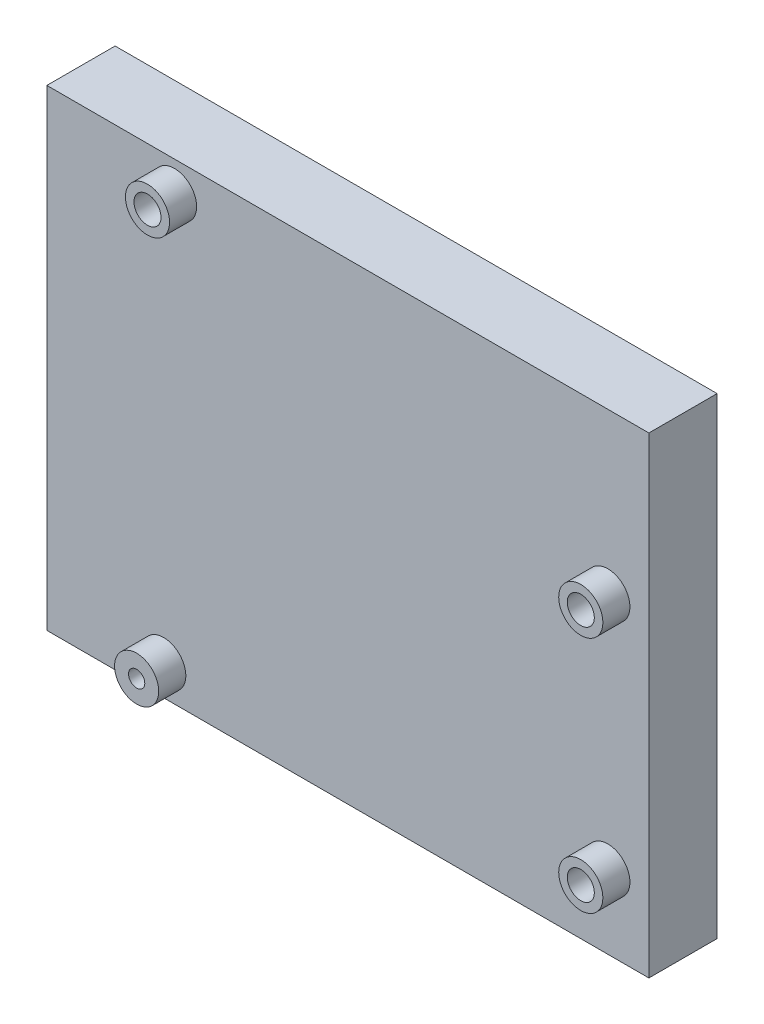
ISO-10303-21;
HEADER;
FILE_DESCRIPTION(('STEP AP214'),'2;1');
FILE_NAME('part.step','',(''),(''),'','','');
FILE_SCHEMA(('AUTOMOTIVE_DESIGN { 1 0 10303 214 1 1 1 1 }'));
ENDSEC;
DATA;
#1=APPLICATION_CONTEXT('core data for automotive mechanical design processes');
#2=APPLICATION_PROTOCOL_DEFINITION('international standard','automotive_design',2000,#1);
#3=PRODUCT_CONTEXT('',#1,'mechanical');
#4=PRODUCT('Part','Part','',(#3));
#5=PRODUCT_RELATED_PRODUCT_CATEGORY('part','',(#4));
#6=PRODUCT_DEFINITION_FORMATION('','',#4);
#7=PRODUCT_DEFINITION_CONTEXT('part definition',#1,'design');
#8=PRODUCT_DEFINITION('design','',#6,#7);
#9=PRODUCT_DEFINITION_SHAPE('','',#8);
#10=(LENGTH_UNIT() NAMED_UNIT(*) SI_UNIT(.MILLI.,.METRE.));
#11=(NAMED_UNIT(*) PLANE_ANGLE_UNIT() SI_UNIT($,.RADIAN.));
#12=(NAMED_UNIT(*) SI_UNIT($,.STERADIAN.) SOLID_ANGLE_UNIT());
#13=UNCERTAINTY_MEASURE_WITH_UNIT(LENGTH_MEASURE(1.E-05),#10,'distance_accuracy_value','');
#14=(GEOMETRIC_REPRESENTATION_CONTEXT(3) GLOBAL_UNCERTAINTY_ASSIGNED_CONTEXT((#13)) GLOBAL_UNIT_ASSIGNED_CONTEXT((#10,
#11,#12)) REPRESENTATION_CONTEXT('',''));
#15=CARTESIAN_POINT('',(0.,0.,0.));
#16=DIRECTION('',(0.,0.,1.));
#17=DIRECTION('',(1.,0.,0.));
#18=AXIS2_PLACEMENT_3D('',#15,#16,#17);
#19=CARTESIAN_POINT('',(0.,0.,4.));
#20=DIRECTION('',(0.,0.,-1.));
#21=DIRECTION('',(-1.,0.,0.));
#22=AXIS2_PLACEMENT_3D('',#19,#20,#21);
#23=PLANE('',#22);
#24=CARTESIAN_POINT('',(-20.3200000000001,24.1299999999999,4.));
#25=DIRECTION('',(0.,0.,-1.));
#26=DIRECTION('',(-1.,0.,0.));
#27=AXIS2_PLACEMENT_3D('',#24,#25,#26);
#28=CIRCLE('',#27,2.5875);
#29=CARTESIAN_POINT('',(-22.9075000000001,24.1299999999999,4.));
#30=VERTEX_POINT('',#29);
#31=EDGE_CURVE('E11',#30,#30,#28,.F.);
#32=ORIENTED_EDGE('',*,*,#31,.F.);
#33=EDGE_LOOP('',(#32));
#34=FACE_BOUND('',#33,.T.);
#35=CARTESIAN_POINT('',(30.4799999999994,-19.0500000000016,4.));
#36=DIRECTION('',(0.,0.,-1.));
#37=DIRECTION('',(-1.,0.,0.));
#38=AXIS2_PLACEMENT_3D('',#35,#36,#37);
#39=CIRCLE('',#38,2.5875);
#40=CARTESIAN_POINT('',(27.8924999999994,-19.0500000000016,4.));
#41=VERTEX_POINT('',#40);
#42=EDGE_CURVE('E48',#41,#41,#39,.F.);
#43=ORIENTED_EDGE('',*,*,#42,.F.);
#44=EDGE_LOOP('',(#43));
#45=FACE_BOUND('',#44,.T.);
#46=CARTESIAN_POINT('',(30.4799999999997,8.88999999999841,4.));
#47=DIRECTION('',(0.,0.,-1.));
#48=DIRECTION('',(-1.,0.,0.));
#49=AXIS2_PLACEMENT_3D('',#46,#47,#48);
#50=CIRCLE('',#49,2.5875);
#51=CARTESIAN_POINT('',(27.8924999999997,8.88999999999841,4.));
#52=VERTEX_POINT('',#51);
#53=EDGE_CURVE('E119',#52,#52,#50,.F.);
#54=ORIENTED_EDGE('',*,*,#53,.F.);
#55=EDGE_LOOP('',(#54));
#56=FACE_BOUND('',#55,.T.);
#57=CARTESIAN_POINT('',(-21.5900000000007,-24.130000000001,4.));
#58=DIRECTION('',(0.,0.,-1.));
#59=DIRECTION('',(-1.,0.,0.));
#60=AXIS2_PLACEMENT_3D('',#57,#58,#59);
#61=CIRCLE('',#60,2.5875);
#62=CARTESIAN_POINT('',(-24.1775000000007,-24.130000000001,4.));
#63=VERTEX_POINT('',#62);
#64=EDGE_CURVE('E116',#63,#63,#61,.F.);
#65=ORIENTED_EDGE('',*,*,#64,.F.);
#66=EDGE_LOOP('',(#65));
#67=FACE_BOUND('',#66,.T.);
#68=DIRECTION('',(0.,1.,0.));
#69=VECTOR('',#68,1.);
#70=CARTESIAN_POINT('',(35.29,-27.6700000000001,4.));
#71=LINE('',#70,#69);
#72=CARTESIAN_POINT('',(35.29,-27.6700000000001,4.));
#73=VERTEX_POINT('',#72);
#74=CARTESIAN_POINT('',(35.29,27.6700000000001,4.));
#75=VERTEX_POINT('',#74);
#76=EDGE_CURVE('E91',#73,#75,#71,.T.);
#77=ORIENTED_EDGE('',*,*,#76,.T.);
#78=DIRECTION('',(-1.,0.,0.));
#79=VECTOR('',#78,1.);
#80=CARTESIAN_POINT('',(-35.2900000000001,27.6700000000001,4.));
#81=LINE('',#80,#79);
#82=CARTESIAN_POINT('',(-35.2900000000001,27.6700000000001,4.));
#83=VERTEX_POINT('',#82);
#84=EDGE_CURVE('E87',#75,#83,#81,.T.);
#85=ORIENTED_EDGE('',*,*,#84,.T.);
#86=DIRECTION('',(0.,-1.,0.));
#87=VECTOR('',#86,1.);
#88=CARTESIAN_POINT('',(-35.2900000000001,-27.6700000000001,4.));
#89=LINE('',#88,#87);
#90=CARTESIAN_POINT('',(-35.2900000000001,-27.6700000000001,4.));
#91=VERTEX_POINT('',#90);
#92=EDGE_CURVE('E89',#83,#91,#89,.T.);
#93=ORIENTED_EDGE('',*,*,#92,.T.);
#94=DIRECTION('',(1.,0.,0.));
#95=VECTOR('',#94,1.);
#96=CARTESIAN_POINT('',(-35.2900000000001,-27.6700000000001,4.));
#97=LINE('',#96,#95);
#98=EDGE_CURVE('E56',#91,#73,#97,.T.);
#99=ORIENTED_EDGE('',*,*,#98,.T.);
#100=EDGE_LOOP('',(#77,#85,#93,#99));
#101=FACE_BOUND('',#100,.T.);
#102=ADVANCED_FACE('F39',(#34,#45,#56,#67,#101),#23,.F.);
#103=CARTESIAN_POINT('',(0.,0.,-4.));
#104=DIRECTION('',(0.,0.,-1.));
#105=DIRECTION('',(-1.,0.,0.));
#106=AXIS2_PLACEMENT_3D('',#103,#104,#105);
#107=PLANE('',#106);
#108=CARTESIAN_POINT('',(-21.5900000000006,-24.130000000001,-4.));
#109=DIRECTION('',(0.,0.,1.));
#110=DIRECTION('',(1.,0.,0.));
#111=AXIS2_PLACEMENT_3D('',#108,#109,#110);
#112=CIRCLE('',#111,1.5875);
#113=CARTESIAN_POINT('',(-20.0025000000006,-24.130000000001,-4.));
#114=VERTEX_POINT('',#113);
#115=EDGE_CURVE('E225',#114,#114,#112,.T.);
#116=ORIENTED_EDGE('',*,*,#115,.T.);
#117=EDGE_LOOP('',(#116));
#118=FACE_BOUND('',#117,.T.);
#119=CARTESIAN_POINT('',(30.4799999999998,8.8899999999985,-4.));
#120=DIRECTION('',(0.,0.,1.));
#121=DIRECTION('',(1.,0.,0.));
#122=AXIS2_PLACEMENT_3D('',#119,#120,#121);
#123=CIRCLE('',#122,1.58750000000001);
#124=CARTESIAN_POINT('',(32.0674999999998,8.8899999999985,-4.));
#125=VERTEX_POINT('',#124);
#126=EDGE_CURVE('E109',#125,#125,#123,.T.);
#127=ORIENTED_EDGE('',*,*,#126,.T.);
#128=EDGE_LOOP('',(#127));
#129=FACE_BOUND('',#128,.T.);
#130=DIRECTION('',(0.,1.,0.));
#131=VECTOR('',#130,1.);
#132=CARTESIAN_POINT('',(35.29,-27.6700000000001,-4.));
#133=LINE('',#132,#131);
#134=CARTESIAN_POINT('',(35.29,-27.6700000000001,-4.));
#135=VERTEX_POINT('',#134);
#136=CARTESIAN_POINT('',(35.29,27.6700000000001,-4.));
#137=VERTEX_POINT('',#136);
#138=EDGE_CURVE('E106',#135,#137,#133,.T.);
#139=ORIENTED_EDGE('',*,*,#138,.F.);
#140=DIRECTION('',(1.,0.,0.));
#141=VECTOR('',#140,1.);
#142=CARTESIAN_POINT('',(-35.2900000000001,-27.6700000000001,-4.));
#143=LINE('',#142,#141);
#144=CARTESIAN_POINT('',(-35.2900000000001,-27.6700000000001,-4.));
#145=VERTEX_POINT('',#144);
#146=EDGE_CURVE('E79',#145,#135,#143,.T.);
#147=ORIENTED_EDGE('',*,*,#146,.F.);
#148=DIRECTION('',(0.,-1.,0.));
#149=VECTOR('',#148,1.);
#150=CARTESIAN_POINT('',(-35.2900000000001,-27.6700000000001,-4.));
#151=LINE('',#150,#149);
#152=CARTESIAN_POINT('',(-35.2900000000001,27.6700000000001,-4.));
#153=VERTEX_POINT('',#152);
#154=EDGE_CURVE('E73',#153,#145,#151,.T.);
#155=ORIENTED_EDGE('',*,*,#154,.F.);
#156=DIRECTION('',(-1.,0.,0.));
#157=VECTOR('',#156,1.);
#158=CARTESIAN_POINT('',(-35.2900000000001,27.6700000000001,-4.));
#159=LINE('',#158,#157);
#160=EDGE_CURVE('E96',#137,#153,#159,.T.);
#161=ORIENTED_EDGE('',*,*,#160,.F.);
#162=EDGE_LOOP('',(#139,#147,#155,#161));
#163=FACE_BOUND('',#162,.T.);
#164=CARTESIAN_POINT('',(30.4799999999995,-19.0500000000015,-4.));
#165=DIRECTION('',(0.,0.,1.));
#166=DIRECTION('',(1.,0.,0.));
#167=AXIS2_PLACEMENT_3D('',#164,#165,#166);
#168=CIRCLE('',#167,1.58750000000001);
#169=CARTESIAN_POINT('',(32.0674999999995,-19.0500000000015,-4.));
#170=VERTEX_POINT('',#169);
#171=EDGE_CURVE('E221',#170,#170,#168,.T.);
#172=ORIENTED_EDGE('',*,*,#171,.T.);
#173=EDGE_LOOP('',(#172));
#174=FACE_BOUND('',#173,.T.);
#175=CARTESIAN_POINT('',(-20.3200000000001,24.1299999999999,-4.));
#176=DIRECTION('',(0.,0.,1.));
#177=DIRECTION('',(1.,0.,0.));
#178=AXIS2_PLACEMENT_3D('',#175,#176,#177);
#179=CIRCLE('',#178,1.5875);
#180=CARTESIAN_POINT('',(-18.7325000000001,24.1299999999999,-4.));
#181=VERTEX_POINT('',#180);
#182=EDGE_CURVE('E224',#181,#181,#179,.T.);
#183=ORIENTED_EDGE('',*,*,#182,.T.);
#184=EDGE_LOOP('',(#183));
#185=FACE_BOUND('',#184,.T.);
#186=ADVANCED_FACE('F128',(#118,#129,#163,#174,#185),#107,.T.);
#187=CARTESIAN_POINT('',(35.29,-27.6700000000001,4.));
#188=DIRECTION('',(-1.,0.,0.));
#189=DIRECTION('',(0.,0.,1.));
#190=AXIS2_PLACEMENT_3D('',#187,#188,#189);
#191=PLANE('',#190);
#192=ORIENTED_EDGE('',*,*,#138,.T.);
#193=DIRECTION('',(0.,0.,-1.));
#194=VECTOR('',#193,1.);
#195=CARTESIAN_POINT('',(35.29,27.6700000000001,4.));
#196=LINE('',#195,#194);
#197=EDGE_CURVE('E97',#75,#137,#196,.T.);
#198=ORIENTED_EDGE('',*,*,#197,.F.);
#199=ORIENTED_EDGE('',*,*,#76,.F.);
#200=DIRECTION('',(0.,0.,-1.));
#201=VECTOR('',#200,1.);
#202=CARTESIAN_POINT('',(35.29,-27.6700000000001,4.));
#203=LINE('',#202,#201);
#204=EDGE_CURVE('E102',#73,#135,#203,.T.);
#205=ORIENTED_EDGE('',*,*,#204,.T.);
#206=EDGE_LOOP('',(#192,#198,#199,#205));
#207=FACE_BOUND('',#206,.T.);
#208=ADVANCED_FACE('F41',(#207),#191,.F.);
#209=CARTESIAN_POINT('',(-35.2900000000001,27.6700000000001,4.));
#210=DIRECTION('',(0.,-1.,0.));
#211=DIRECTION('',(0.,0.,-1.));
#212=AXIS2_PLACEMENT_3D('',#209,#210,#211);
#213=PLANE('',#212);
#214=ORIENTED_EDGE('',*,*,#160,.T.);
#215=DIRECTION('',(0.,0.,-1.));
#216=VECTOR('',#215,1.);
#217=CARTESIAN_POINT('',(-35.2900000000001,27.6700000000001,4.));
#218=LINE('',#217,#216);
#219=EDGE_CURVE('E94',#83,#153,#218,.T.);
#220=ORIENTED_EDGE('',*,*,#219,.F.);
#221=ORIENTED_EDGE('',*,*,#84,.F.);
#222=ORIENTED_EDGE('',*,*,#197,.T.);
#223=EDGE_LOOP('',(#214,#220,#221,#222));
#224=FACE_BOUND('',#223,.T.);
#225=ADVANCED_FACE('F95',(#224),#213,.F.);
#226=CARTESIAN_POINT('',(-35.2900000000001,-27.6700000000001,4.));
#227=DIRECTION('',(1.,0.,0.));
#228=DIRECTION('',(0.,0.,-1.));
#229=AXIS2_PLACEMENT_3D('',#226,#227,#228);
#230=PLANE('',#229);
#231=ORIENTED_EDGE('',*,*,#154,.T.);
#232=DIRECTION('',(0.,0.,-1.));
#233=VECTOR('',#232,1.);
#234=CARTESIAN_POINT('',(-35.2900000000001,-27.6700000000001,4.));
#235=LINE('',#234,#233);
#236=EDGE_CURVE('E98',#91,#145,#235,.T.);
#237=ORIENTED_EDGE('',*,*,#236,.F.);
#238=ORIENTED_EDGE('',*,*,#92,.F.);
#239=ORIENTED_EDGE('',*,*,#219,.T.);
#240=EDGE_LOOP('',(#231,#237,#238,#239));
#241=FACE_BOUND('',#240,.T.);
#242=ADVANCED_FACE('F100',(#241),#230,.F.);
#243=CARTESIAN_POINT('',(-35.2900000000001,-27.6700000000001,4.));
#244=DIRECTION('',(0.,1.,0.));
#245=DIRECTION('',(0.,0.,1.));
#246=AXIS2_PLACEMENT_3D('',#243,#244,#245);
#247=PLANE('',#246);
#248=CARTESIAN_POINT('',(30.,-27.6700000000001,0.));
#249=DIRECTION('',(0.,1.,0.));
#250=DIRECTION('',(0.,0.,1.));
#251=AXIS2_PLACEMENT_3D('',#248,#249,#250);
#252=CIRCLE('',#251,2.5);
#253=CARTESIAN_POINT('',(30.,-27.6700000000001,2.5));
#254=VERTEX_POINT('',#253);
#255=EDGE_CURVE('E231',#254,#254,#252,.T.);
#256=ORIENTED_EDGE('',*,*,#255,.T.);
#257=EDGE_LOOP('',(#256));
#258=FACE_BOUND('',#257,.T.);
#259=CARTESIAN_POINT('',(-30.,-27.6700000000001,0.));
#260=DIRECTION('',(0.,1.,0.));
#261=DIRECTION('',(0.,0.,-1.));
#262=AXIS2_PLACEMENT_3D('',#259,#260,#261);
#263=CIRCLE('',#262,2.5);
#264=CARTESIAN_POINT('',(-30.,-27.6700000000001,-2.5));
#265=VERTEX_POINT('',#264);
#266=EDGE_CURVE('E262',#265,#265,#263,.T.);
#267=ORIENTED_EDGE('',*,*,#266,.T.);
#268=EDGE_LOOP('',(#267));
#269=FACE_BOUND('',#268,.T.);
#270=ORIENTED_EDGE('',*,*,#146,.T.);
#271=ORIENTED_EDGE('',*,*,#204,.F.);
#272=ORIENTED_EDGE('',*,*,#98,.F.);
#273=ORIENTED_EDGE('',*,*,#236,.T.);
#274=EDGE_LOOP('',(#270,#271,#272,#273));
#275=FACE_BOUND('',#274,.T.);
#276=ADVANCED_FACE('F198',(#258,#269,#275),#247,.F.);
#277=CARTESIAN_POINT('',(30.4799999999998,8.8899999999985,4.));
#278=DIRECTION('',(0.,0.,-1.));
#279=DIRECTION('',(-1.,0.,0.));
#280=AXIS2_PLACEMENT_3D('',#277,#278,#279);
#281=CYLINDRICAL_SURFACE('',#280,1.58750000000001);
#282=ORIENTED_EDGE('',*,*,#126,.F.);
#283=EDGE_LOOP('',(#282));
#284=FACE_BOUND('',#283,.T.);
#285=CARTESIAN_POINT('',(30.4799999999997,8.88999999999841,7.175));
#286=DIRECTION('',(0.,0.,1.));
#287=DIRECTION('',(1.,0.,0.));
#288=AXIS2_PLACEMENT_3D('',#285,#286,#287);
#289=CIRCLE('',#288,1.58750000000001);
#290=CARTESIAN_POINT('',(32.0674999999997,8.88999999999841,7.175));
#291=VERTEX_POINT('',#290);
#292=EDGE_CURVE('E244',#291,#291,#289,.T.);
#293=ORIENTED_EDGE('',*,*,#292,.T.);
#294=EDGE_LOOP('',(#293));
#295=FACE_BOUND('',#294,.T.);
#296=ADVANCED_FACE('F195',(#284,#295),#281,.F.);
#297=CARTESIAN_POINT('',(30.4799999999995,-19.0500000000015,4.));
#298=DIRECTION('',(0.,0.,-1.));
#299=DIRECTION('',(-1.,0.,0.));
#300=AXIS2_PLACEMENT_3D('',#297,#298,#299);
#301=CYLINDRICAL_SURFACE('',#300,1.58750000000001);
#302=ORIENTED_EDGE('',*,*,#171,.F.);
#303=EDGE_LOOP('',(#302));
#304=FACE_BOUND('',#303,.T.);
#305=CARTESIAN_POINT('',(30.4799999999994,-19.0500000000016,7.175));
#306=DIRECTION('',(0.,0.,1.));
#307=DIRECTION('',(1.,0.,0.));
#308=AXIS2_PLACEMENT_3D('',#305,#306,#307);
#309=CIRCLE('',#308,1.58750000000001);
#310=CARTESIAN_POINT('',(32.0674999999994,-19.0500000000016,7.175));
#311=VERTEX_POINT('',#310);
#312=EDGE_CURVE('E253',#311,#311,#309,.T.);
#313=ORIENTED_EDGE('',*,*,#312,.T.);
#314=EDGE_LOOP('',(#313));
#315=FACE_BOUND('',#314,.T.);
#316=ADVANCED_FACE('F191',(#304,#315),#301,.F.);
#317=CARTESIAN_POINT('',(-21.5900000000006,-24.130000000001,4.));
#318=DIRECTION('',(0.,0.,-1.));
#319=DIRECTION('',(-1.,0.,0.));
#320=AXIS2_PLACEMENT_3D('',#317,#318,#319);
#321=CYLINDRICAL_SURFACE('',#320,1.5875);
#322=CARTESIAN_POINT('',(-21.5900000000006,-24.130000000001,4.));
#323=DIRECTION('',(0.,0.,1.));
#324=DIRECTION('',(1.,0.,0.));
#325=AXIS2_PLACEMENT_3D('',#322,#323,#324);
#326=CIRCLE('',#325,1.5875);
#327=CARTESIAN_POINT('',(-20.0025000000006,-24.130000000001,4.));
#328=VERTEX_POINT('',#327);
#329=EDGE_CURVE('E257',#328,#328,#326,.T.);
#330=ORIENTED_EDGE('',*,*,#329,.T.);
#331=EDGE_LOOP('',(#330));
#332=FACE_BOUND('',#331,.T.);
#333=ORIENTED_EDGE('',*,*,#115,.F.);
#334=EDGE_LOOP('',(#333));
#335=FACE_BOUND('',#334,.T.);
#336=ADVANCED_FACE('F187',(#332,#335),#321,.F.);
#337=CARTESIAN_POINT('',(-20.3200000000001,24.1299999999999,4.));
#338=DIRECTION('',(0.,0.,-1.));
#339=DIRECTION('',(-1.,0.,0.));
#340=AXIS2_PLACEMENT_3D('',#337,#338,#339);
#341=CYLINDRICAL_SURFACE('',#340,1.5875);
#342=ORIENTED_EDGE('',*,*,#182,.F.);
#343=EDGE_LOOP('',(#342));
#344=FACE_BOUND('',#343,.T.);
#345=CARTESIAN_POINT('',(-20.3200000000001,24.1299999999999,7.175));
#346=DIRECTION('',(0.,0.,1.));
#347=DIRECTION('',(1.,0.,0.));
#348=AXIS2_PLACEMENT_3D('',#345,#346,#347);
#349=CIRCLE('',#348,1.5875);
#350=CARTESIAN_POINT('',(-18.7325000000001,24.1299999999999,7.175));
#351=VERTEX_POINT('',#350);
#352=EDGE_CURVE('E273',#351,#351,#349,.T.);
#353=ORIENTED_EDGE('',*,*,#352,.T.);
#354=EDGE_LOOP('',(#353));
#355=FACE_BOUND('',#354,.T.);
#356=ADVANCED_FACE('F180',(#344,#355),#341,.F.);
#357=CARTESIAN_POINT('',(-30.,-21.6700000000001,0.));
#358=DIRECTION('',(0.,-1.,0.));
#359=DIRECTION('',(0.,0.,-1.));
#360=AXIS2_PLACEMENT_3D('',#357,#358,#359);
#361=CYLINDRICAL_SURFACE('',#360,2.5);
#362=CARTESIAN_POINT('',(-30.,-21.6700000000001,0.));
#363=DIRECTION('',(0.,1.,0.));
#364=DIRECTION('',(0.,0.,-1.));
#365=AXIS2_PLACEMENT_3D('',#362,#363,#364);
#366=CIRCLE('',#365,2.5);
#367=CARTESIAN_POINT('',(-30.,-21.6700000000001,-2.5));
#368=VERTEX_POINT('',#367);
#369=EDGE_CURVE('E234',#368,#368,#366,.T.);
#370=ORIENTED_EDGE('',*,*,#369,.T.);
#371=EDGE_LOOP('',(#370));
#372=FACE_BOUND('',#371,.T.);
#373=ORIENTED_EDGE('',*,*,#266,.F.);
#374=EDGE_LOOP('',(#373));
#375=FACE_BOUND('',#374,.T.);
#376=ADVANCED_FACE('F177',(#372,#375),#361,.F.);
#377=CARTESIAN_POINT('',(-30.,-21.6700000000001,0.));
#378=DIRECTION('',(0.,-1.,0.));
#379=DIRECTION('',(0.,0.,-1.));
#380=AXIS2_PLACEMENT_3D('',#377,#378,#379);
#381=PLANE('',#380);
#382=ORIENTED_EDGE('',*,*,#369,.F.);
#383=EDGE_LOOP('',(#382));
#384=FACE_BOUND('',#383,.T.);
#385=ADVANCED_FACE('F175',(#384),#381,.T.);
#386=CARTESIAN_POINT('',(30.,-21.6700000000001,0.));
#387=DIRECTION('',(0.,-1.,0.));
#388=DIRECTION('',(0.,0.,-1.));
#389=AXIS2_PLACEMENT_3D('',#386,#387,#388);
#390=CYLINDRICAL_SURFACE('',#389,2.5);
#391=CARTESIAN_POINT('',(30.,-21.6700000000001,0.));
#392=DIRECTION('',(0.,1.,0.));
#393=DIRECTION('',(0.,0.,1.));
#394=AXIS2_PLACEMENT_3D('',#391,#392,#393);
#395=CIRCLE('',#394,2.5);
#396=CARTESIAN_POINT('',(30.,-21.6700000000001,2.5));
#397=VERTEX_POINT('',#396);
#398=EDGE_CURVE('E226',#397,#397,#395,.T.);
#399=ORIENTED_EDGE('',*,*,#398,.T.);
#400=EDGE_LOOP('',(#399));
#401=FACE_BOUND('',#400,.T.);
#402=ORIENTED_EDGE('',*,*,#255,.F.);
#403=EDGE_LOOP('',(#402));
#404=FACE_BOUND('',#403,.T.);
#405=ADVANCED_FACE('F171',(#401,#404),#390,.F.);
#406=CARTESIAN_POINT('',(30.,-21.6700000000001,0.));
#407=DIRECTION('',(0.,1.,0.));
#408=DIRECTION('',(0.,0.,1.));
#409=AXIS2_PLACEMENT_3D('',#406,#407,#408);
#410=PLANE('',#409);
#411=ORIENTED_EDGE('',*,*,#398,.F.);
#412=EDGE_LOOP('',(#411));
#413=FACE_BOUND('',#412,.T.);
#414=ADVANCED_FACE('F167',(#413),#410,.F.);
#415=CARTESIAN_POINT('',(-20.3200000000001,24.1299999999999,7.175));
#416=DIRECTION('',(0.,0.,1.));
#417=DIRECTION('',(1.,0.,0.));
#418=AXIS2_PLACEMENT_3D('',#415,#416,#417);
#419=PLANE('',#418);
#420=CARTESIAN_POINT('',(-20.3200000000001,24.1299999999999,7.175));
#421=DIRECTION('',(0.,0.,1.));
#422=DIRECTION('',(1.,0.,0.));
#423=AXIS2_PLACEMENT_3D('',#420,#421,#422);
#424=CIRCLE('',#423,2.5875);
#425=CARTESIAN_POINT('',(-17.7325000000001,24.1299999999999,7.175));
#426=VERTEX_POINT('',#425);
#427=EDGE_CURVE('E259',#426,#426,#424,.T.);
#428=ORIENTED_EDGE('',*,*,#427,.T.);
#429=EDGE_LOOP('',(#428));
#430=FACE_BOUND('',#429,.T.);
#431=ORIENTED_EDGE('',*,*,#352,.F.);
#432=EDGE_LOOP('',(#431));
#433=FACE_BOUND('',#432,.T.);
#434=ADVANCED_FACE('F170',(#430,#433),#419,.T.);
#435=CARTESIAN_POINT('',(-20.3200000000001,24.1299999999999,7.175));
#436=DIRECTION('',(0.,0.,-1.));
#437=DIRECTION('',(-1.,0.,0.));
#438=AXIS2_PLACEMENT_3D('',#435,#436,#437);
#439=CYLINDRICAL_SURFACE('',#438,2.5875);
#440=ORIENTED_EDGE('',*,*,#427,.F.);
#441=EDGE_LOOP('',(#440));
#442=FACE_BOUND('',#441,.T.);
#443=ORIENTED_EDGE('',*,*,#31,.T.);
#444=EDGE_LOOP('',(#443));
#445=FACE_BOUND('',#444,.T.);
#446=ADVANCED_FACE('F156',(#442,#445),#439,.T.);
#447=CARTESIAN_POINT('',(-21.5900000000007,-24.130000000001,4.));
#448=DIRECTION('',(0.,0.,1.));
#449=DIRECTION('',(1.,0.,0.));
#450=AXIS2_PLACEMENT_3D('',#447,#448,#449);
#451=PLANE('',#450);
#452=CARTESIAN_POINT('',(-21.5900000000007,-24.130000000001,4.));
#453=DIRECTION('',(0.,0.,1.));
#454=DIRECTION('',(1.,0.,0.));
#455=AXIS2_PLACEMENT_3D('',#452,#453,#454);
#456=CIRCLE('',#455,0.952500000000776);
#457=CARTESIAN_POINT('',(-20.6374999999999,-24.130000000001,4.));
#458=VERTEX_POINT('',#457);
#459=EDGE_CURVE('E278',#458,#458,#456,.T.);
#460=ORIENTED_EDGE('',*,*,#459,.T.);
#461=EDGE_LOOP('',(#460));
#462=FACE_BOUND('',#461,.T.);
#463=ORIENTED_EDGE('',*,*,#329,.F.);
#464=EDGE_LOOP('',(#463));
#465=FACE_BOUND('',#464,.T.);
#466=ADVANCED_FACE('F148',(#462,#465),#451,.F.);
#467=CARTESIAN_POINT('',(-21.5900000000007,-24.130000000001,7.175));
#468=DIRECTION('',(0.,0.,1.));
#469=DIRECTION('',(1.,0.,0.));
#470=AXIS2_PLACEMENT_3D('',#467,#468,#469);
#471=PLANE('',#470);
#472=CARTESIAN_POINT('',(-21.5900000000007,-24.130000000001,7.175));
#473=DIRECTION('',(0.,0.,1.));
#474=DIRECTION('',(1.,0.,0.));
#475=AXIS2_PLACEMENT_3D('',#472,#473,#474);
#476=CIRCLE('',#475,2.5875);
#477=CARTESIAN_POINT('',(-19.0025000000007,-24.130000000001,7.175));
#478=VERTEX_POINT('',#477);
#479=EDGE_CURVE('E246',#478,#478,#476,.T.);
#480=ORIENTED_EDGE('',*,*,#479,.T.);
#481=EDGE_LOOP('',(#480));
#482=FACE_BOUND('',#481,.T.);
#483=CARTESIAN_POINT('',(-21.5900000000007,-24.130000000001,7.175));
#484=DIRECTION('',(0.,0.,1.));
#485=DIRECTION('',(1.,0.,0.));
#486=AXIS2_PLACEMENT_3D('',#483,#484,#485);
#487=CIRCLE('',#486,0.952500000000776);
#488=CARTESIAN_POINT('',(-20.6374999999999,-24.130000000001,7.175));
#489=VERTEX_POINT('',#488);
#490=EDGE_CURVE('E250',#489,#489,#487,.T.);
#491=ORIENTED_EDGE('',*,*,#490,.F.);
#492=EDGE_LOOP('',(#491));
#493=FACE_BOUND('',#492,.T.);
#494=ADVANCED_FACE('F138',(#482,#493),#471,.T.);
#495=CARTESIAN_POINT('',(-21.5900000000007,-24.130000000001,7.175));
#496=DIRECTION('',(0.,0.,-1.));
#497=DIRECTION('',(-1.,0.,0.));
#498=AXIS2_PLACEMENT_3D('',#495,#496,#497);
#499=CYLINDRICAL_SURFACE('',#498,2.5875);
#500=ORIENTED_EDGE('',*,*,#479,.F.);
#501=EDGE_LOOP('',(#500));
#502=FACE_BOUND('',#501,.T.);
#503=ORIENTED_EDGE('',*,*,#64,.T.);
#504=EDGE_LOOP('',(#503));
#505=FACE_BOUND('',#504,.T.);
#506=ADVANCED_FACE('F135',(#502,#505),#499,.T.);
#507=CARTESIAN_POINT('',(-21.5900000000007,-24.130000000001,7.175));
#508=DIRECTION('',(0.,0.,-1.));
#509=DIRECTION('',(-1.,0.,0.));
#510=AXIS2_PLACEMENT_3D('',#507,#508,#509);
#511=CYLINDRICAL_SURFACE('',#510,0.952500000000776);
#512=ORIENTED_EDGE('',*,*,#490,.T.);
#513=EDGE_LOOP('',(#512));
#514=FACE_BOUND('',#513,.T.);
#515=ORIENTED_EDGE('',*,*,#459,.F.);
#516=EDGE_LOOP('',(#515));
#517=FACE_BOUND('',#516,.T.);
#518=ADVANCED_FACE('F137',(#514,#517),#511,.F.);
#519=CARTESIAN_POINT('',(30.4799999999994,-19.0500000000016,7.175));
#520=DIRECTION('',(0.,0.,1.));
#521=DIRECTION('',(1.,0.,0.));
#522=AXIS2_PLACEMENT_3D('',#519,#520,#521);
#523=PLANE('',#522);
#524=CARTESIAN_POINT('',(30.4799999999994,-19.0500000000016,7.175));
#525=DIRECTION('',(0.,0.,1.));
#526=DIRECTION('',(1.,0.,0.));
#527=AXIS2_PLACEMENT_3D('',#524,#525,#526);
#528=CIRCLE('',#527,2.5875);
#529=CARTESIAN_POINT('',(33.0674999999994,-19.0500000000016,7.175));
#530=VERTEX_POINT('',#529);
#531=EDGE_CURVE('E281',#530,#530,#528,.T.);
#532=ORIENTED_EDGE('',*,*,#531,.T.);
#533=EDGE_LOOP('',(#532));
#534=FACE_BOUND('',#533,.T.);
#535=ORIENTED_EDGE('',*,*,#312,.F.);
#536=EDGE_LOOP('',(#535));
#537=FACE_BOUND('',#536,.T.);
#538=ADVANCED_FACE('F145',(#534,#537),#523,.T.);
#539=CARTESIAN_POINT('',(30.4799999999994,-19.0500000000016,7.175));
#540=DIRECTION('',(0.,0.,-1.));
#541=DIRECTION('',(-1.,0.,0.));
#542=AXIS2_PLACEMENT_3D('',#539,#540,#541);
#543=CYLINDRICAL_SURFACE('',#542,2.5875);
#544=ORIENTED_EDGE('',*,*,#531,.F.);
#545=EDGE_LOOP('',(#544));
#546=FACE_BOUND('',#545,.T.);
#547=ORIENTED_EDGE('',*,*,#42,.T.);
#548=EDGE_LOOP('',(#547));
#549=FACE_BOUND('',#548,.T.);
#550=ADVANCED_FACE('F124',(#546,#549),#543,.T.);
#551=CARTESIAN_POINT('',(30.4799999999997,8.88999999999841,7.175));
#552=DIRECTION('',(0.,0.,1.));
#553=DIRECTION('',(1.,0.,0.));
#554=AXIS2_PLACEMENT_3D('',#551,#552,#553);
#555=PLANE('',#554);
#556=CARTESIAN_POINT('',(30.4799999999997,8.88999999999841,7.175));
#557=DIRECTION('',(0.,0.,1.));
#558=DIRECTION('',(1.,0.,0.));
#559=AXIS2_PLACEMENT_3D('',#556,#557,#558);
#560=CIRCLE('',#559,2.5875);
#561=CARTESIAN_POINT('',(33.0674999999997,8.88999999999841,7.175));
#562=VERTEX_POINT('',#561);
#563=EDGE_CURVE('E247',#562,#562,#560,.T.);
#564=ORIENTED_EDGE('',*,*,#563,.T.);
#565=EDGE_LOOP('',(#564));
#566=FACE_BOUND('',#565,.T.);
#567=ORIENTED_EDGE('',*,*,#292,.F.);
#568=EDGE_LOOP('',(#567));
#569=FACE_BOUND('',#568,.T.);
#570=ADVANCED_FACE('F162',(#566,#569),#555,.T.);
#571=CARTESIAN_POINT('',(30.4799999999997,8.88999999999841,7.175));
#572=DIRECTION('',(0.,0.,-1.));
#573=DIRECTION('',(-1.,0.,0.));
#574=AXIS2_PLACEMENT_3D('',#571,#572,#573);
#575=CYLINDRICAL_SURFACE('',#574,2.5875);
#576=ORIENTED_EDGE('',*,*,#563,.F.);
#577=EDGE_LOOP('',(#576));
#578=FACE_BOUND('',#577,.T.);
#579=ORIENTED_EDGE('',*,*,#53,.T.);
#580=EDGE_LOOP('',(#579));
#581=FACE_BOUND('',#580,.T.);
#582=ADVANCED_FACE('F159',(#578,#581),#575,.T.);
#583=CLOSED_SHELL('',(#102,#186,#208,#225,#242,#276,#296,#316,#336,#356,#376,#385,#405,#414,
#434,#446,#466,#494,#506,#518,#538,#550,#570,#582));
#584=MANIFOLD_SOLID_BREP('B2',#583);
#585=ADVANCED_BREP_SHAPE_REPRESENTATION('',(#18,#584),#14);
#586=SHAPE_DEFINITION_REPRESENTATION(#9,#585);
ENDSEC;
END-ISO-10303-21;
